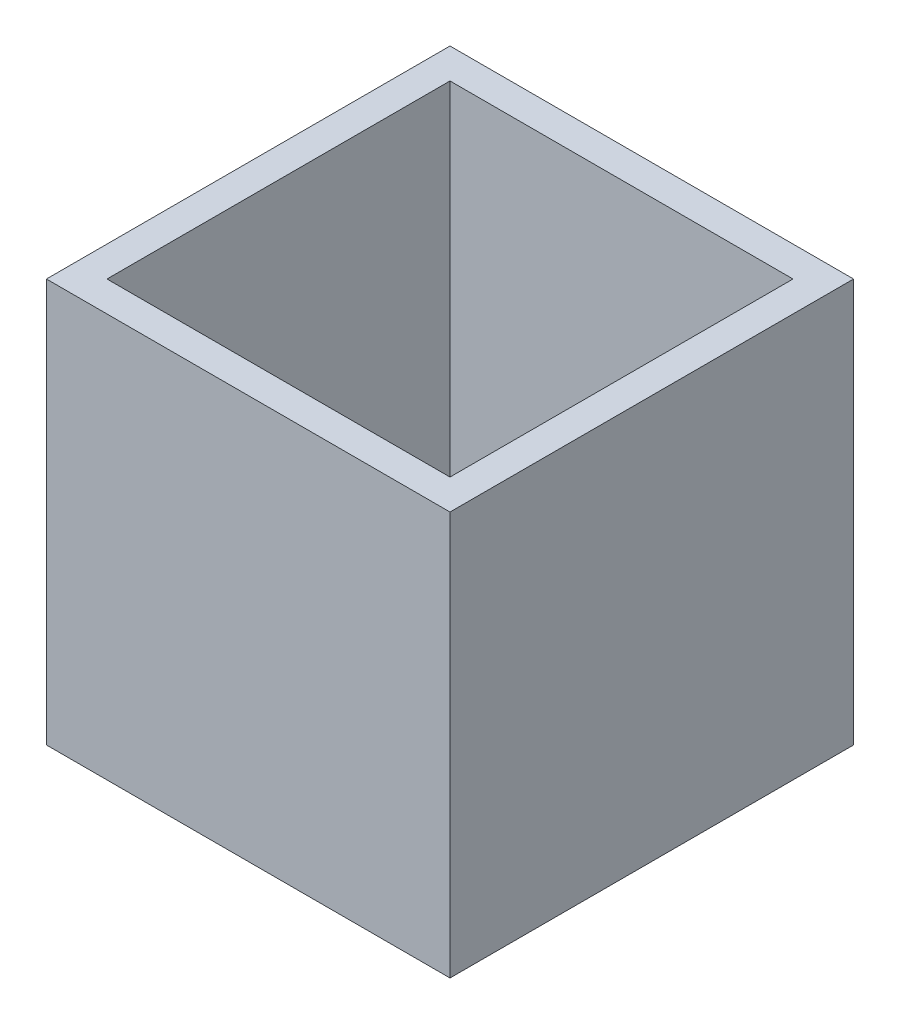
ISO-10303-21;
HEADER;
FILE_DESCRIPTION(('STEP AP214'),'2;1');
FILE_NAME('part.step','',(''),(''),'','','');
FILE_SCHEMA(('AUTOMOTIVE_DESIGN { 1 0 10303 214 1 1 1 1 }'));
ENDSEC;
DATA;
#1=APPLICATION_CONTEXT('core data for automotive mechanical design processes');
#2=APPLICATION_PROTOCOL_DEFINITION('international standard','automotive_design',2000,#1);
#3=PRODUCT_CONTEXT('',#1,'mechanical');
#4=PRODUCT('Part','Part','',(#3));
#5=PRODUCT_RELATED_PRODUCT_CATEGORY('part','',(#4));
#6=PRODUCT_DEFINITION_FORMATION('','',#4);
#7=PRODUCT_DEFINITION_CONTEXT('part definition',#1,'design');
#8=PRODUCT_DEFINITION('design','',#6,#7);
#9=PRODUCT_DEFINITION_SHAPE('','',#8);
#10=(LENGTH_UNIT() NAMED_UNIT(*) SI_UNIT(.MILLI.,.METRE.));
#11=(NAMED_UNIT(*) PLANE_ANGLE_UNIT() SI_UNIT($,.RADIAN.));
#12=(NAMED_UNIT(*) SI_UNIT($,.STERADIAN.) SOLID_ANGLE_UNIT());
#13=UNCERTAINTY_MEASURE_WITH_UNIT(LENGTH_MEASURE(1.E-05),#10,'distance_accuracy_value','');
#14=(GEOMETRIC_REPRESENTATION_CONTEXT(3) GLOBAL_UNCERTAINTY_ASSIGNED_CONTEXT((#13)) GLOBAL_UNIT_ASSIGNED_CONTEXT((#10,
#11,#12)) REPRESENTATION_CONTEXT('',''));
#15=CARTESIAN_POINT('',(0.,0.,0.));
#16=DIRECTION('',(0.,0.,1.));
#17=DIRECTION('',(1.,0.,0.));
#18=AXIS2_PLACEMENT_3D('',#15,#16,#17);
#19=CARTESIAN_POINT('',(0.,20.,0.));
#20=DIRECTION('',(-1.,0.,0.));
#21=DIRECTION('',(0.,0.,1.));
#22=AXIS2_PLACEMENT_3D('',#19,#20,#21);
#23=PLANE('',#22);
#24=DIRECTION('',(0.,0.,-1.));
#25=VECTOR('',#24,1.);
#26=CARTESIAN_POINT('',(0.,0.,0.));
#27=LINE('',#26,#25);
#28=CARTESIAN_POINT('',(0.,0.,0.));
#29=VERTEX_POINT('',#28);
#30=CARTESIAN_POINT('',(0.,0.,-20.));
#31=VERTEX_POINT('',#30);
#32=EDGE_CURVE('E149',#29,#31,#27,.T.);
#33=ORIENTED_EDGE('',*,*,#32,.T.);
#34=DIRECTION('',(0.,-1.,0.));
#35=VECTOR('',#34,1.);
#36=CARTESIAN_POINT('',(0.,20.,-20.));
#37=LINE('',#36,#35);
#38=CARTESIAN_POINT('',(0.,20.,-20.));
#39=VERTEX_POINT('',#38);
#40=EDGE_CURVE('E11',#39,#31,#37,.T.);
#41=ORIENTED_EDGE('',*,*,#40,.F.);
#42=DIRECTION('',(0.,0.,-1.));
#43=VECTOR('',#42,1.);
#44=CARTESIAN_POINT('',(0.,20.,0.));
#45=LINE('',#44,#43);
#46=CARTESIAN_POINT('',(0.,20.,0.));
#47=VERTEX_POINT('',#46);
#48=EDGE_CURVE('E142',#47,#39,#45,.T.);
#49=ORIENTED_EDGE('',*,*,#48,.F.);
#50=DIRECTION('',(0.,-1.,0.));
#51=VECTOR('',#50,1.);
#52=CARTESIAN_POINT('',(0.,20.,0.));
#53=LINE('',#52,#51);
#54=EDGE_CURVE('E148',#47,#29,#53,.T.);
#55=ORIENTED_EDGE('',*,*,#54,.T.);
#56=EDGE_LOOP('',(#33,#41,#49,#55));
#57=FACE_BOUND('',#56,.T.);
#58=ADVANCED_FACE('F33',(#57),#23,.F.);
#59=CARTESIAN_POINT('',(0.,20.,-20.));
#60=DIRECTION('',(0.,0.,1.));
#61=DIRECTION('',(1.,0.,0.));
#62=AXIS2_PLACEMENT_3D('',#59,#60,#61);
#63=PLANE('',#62);
#64=DIRECTION('',(-1.,0.,0.));
#65=VECTOR('',#64,1.);
#66=CARTESIAN_POINT('',(0.,0.,-20.));
#67=LINE('',#66,#65);
#68=CARTESIAN_POINT('',(-20.,0.,-20.));
#69=VERTEX_POINT('',#68);
#70=EDGE_CURVE('E152',#31,#69,#67,.T.);
#71=ORIENTED_EDGE('',*,*,#70,.T.);
#72=DIRECTION('',(0.,-1.,0.));
#73=VECTOR('',#72,1.);
#74=CARTESIAN_POINT('',(-20.,20.,-20.));
#75=LINE('',#74,#73);
#76=CARTESIAN_POINT('',(-20.,20.,-20.));
#77=VERTEX_POINT('',#76);
#78=EDGE_CURVE('E41',#77,#69,#75,.T.);
#79=ORIENTED_EDGE('',*,*,#78,.F.);
#80=DIRECTION('',(-1.,0.,0.));
#81=VECTOR('',#80,1.);
#82=CARTESIAN_POINT('',(0.,20.,-20.));
#83=LINE('',#82,#81);
#84=EDGE_CURVE('E86',#39,#77,#83,.T.);
#85=ORIENTED_EDGE('',*,*,#84,.F.);
#86=ORIENTED_EDGE('',*,*,#40,.T.);
#87=EDGE_LOOP('',(#71,#79,#85,#86));
#88=FACE_BOUND('',#87,.T.);
#89=ADVANCED_FACE('F199',(#88),#63,.F.);
#90=CARTESIAN_POINT('',(-20.,20.,0.));
#91=DIRECTION('',(1.,0.,0.));
#92=DIRECTION('',(0.,0.,-1.));
#93=AXIS2_PLACEMENT_3D('',#90,#91,#92);
#94=PLANE('',#93);
#95=DIRECTION('',(0.,0.,1.));
#96=VECTOR('',#95,1.);
#97=CARTESIAN_POINT('',(-20.,0.,0.));
#98=LINE('',#97,#96);
#99=CARTESIAN_POINT('',(-20.,0.,0.));
#100=VERTEX_POINT('',#99);
#101=EDGE_CURVE('E154',#69,#100,#98,.T.);
#102=ORIENTED_EDGE('',*,*,#101,.T.);
#103=DIRECTION('',(0.,-1.,0.));
#104=VECTOR('',#103,1.);
#105=CARTESIAN_POINT('',(-20.,20.,0.));
#106=LINE('',#105,#104);
#107=CARTESIAN_POINT('',(-20.,20.,0.));
#108=VERTEX_POINT('',#107);
#109=EDGE_CURVE('E158',#108,#100,#106,.T.);
#110=ORIENTED_EDGE('',*,*,#109,.F.);
#111=DIRECTION('',(0.,0.,1.));
#112=VECTOR('',#111,1.);
#113=CARTESIAN_POINT('',(-20.,20.,0.));
#114=LINE('',#113,#112);
#115=EDGE_CURVE('E145',#77,#108,#114,.T.);
#116=ORIENTED_EDGE('',*,*,#115,.F.);
#117=ORIENTED_EDGE('',*,*,#78,.T.);
#118=EDGE_LOOP('',(#102,#110,#116,#117));
#119=FACE_BOUND('',#118,.T.);
#120=ADVANCED_FACE('F204',(#119),#94,.F.);
#121=CARTESIAN_POINT('',(0.,20.,0.));
#122=DIRECTION('',(0.,0.,-1.));
#123=DIRECTION('',(-1.,0.,0.));
#124=AXIS2_PLACEMENT_3D('',#121,#122,#123);
#125=PLANE('',#124);
#126=DIRECTION('',(1.,0.,0.));
#127=VECTOR('',#126,1.);
#128=CARTESIAN_POINT('',(0.,0.,0.));
#129=LINE('',#128,#127);
#130=EDGE_CURVE('E79',#100,#29,#129,.T.);
#131=ORIENTED_EDGE('',*,*,#130,.T.);
#132=ORIENTED_EDGE('',*,*,#54,.F.);
#133=DIRECTION('',(1.,0.,0.));
#134=VECTOR('',#133,1.);
#135=CARTESIAN_POINT('',(0.,20.,0.));
#136=LINE('',#135,#134);
#137=EDGE_CURVE('E58',#108,#47,#136,.T.);
#138=ORIENTED_EDGE('',*,*,#137,.F.);
#139=ORIENTED_EDGE('',*,*,#109,.T.);
#140=EDGE_LOOP('',(#131,#132,#138,#139));
#141=FACE_BOUND('',#140,.T.);
#142=ADVANCED_FACE('F193',(#141),#125,.F.);
#143=CARTESIAN_POINT('',(0.,20.,0.));
#144=DIRECTION('',(0.,1.,0.));
#145=DIRECTION('',(0.,0.,1.));
#146=AXIS2_PLACEMENT_3D('',#143,#144,#145);
#147=PLANE('',#146);
#148=DIRECTION('',(0.,0.,-1.));
#149=VECTOR('',#148,1.);
#150=CARTESIAN_POINT('',(-1.5,20.,0.));
#151=LINE('',#150,#149);
#152=CARTESIAN_POINT('',(-1.5,20.,-1.5));
#153=VERTEX_POINT('',#152);
#154=CARTESIAN_POINT('',(-1.5,20.,-18.5));
#155=VERTEX_POINT('',#154);
#156=EDGE_CURVE('E131',#153,#155,#151,.T.);
#157=ORIENTED_EDGE('',*,*,#156,.F.);
#158=DIRECTION('',(1.,0.,0.));
#159=VECTOR('',#158,1.);
#160=CARTESIAN_POINT('',(0.,20.,-1.5));
#161=LINE('',#160,#159);
#162=CARTESIAN_POINT('',(-18.5,20.,-1.5));
#163=VERTEX_POINT('',#162);
#164=EDGE_CURVE('E140',#163,#153,#161,.T.);
#165=ORIENTED_EDGE('',*,*,#164,.F.);
#166=DIRECTION('',(0.,0.,1.));
#167=VECTOR('',#166,1.);
#168=CARTESIAN_POINT('',(-18.5,20.,0.));
#169=LINE('',#168,#167);
#170=CARTESIAN_POINT('',(-18.5,20.,-18.5));
#171=VERTEX_POINT('',#170);
#172=EDGE_CURVE('E138',#171,#163,#169,.T.);
#173=ORIENTED_EDGE('',*,*,#172,.F.);
#174=DIRECTION('',(-1.,0.,0.));
#175=VECTOR('',#174,1.);
#176=CARTESIAN_POINT('',(0.,20.,-18.5));
#177=LINE('',#176,#175);
#178=EDGE_CURVE('E123',#155,#171,#177,.T.);
#179=ORIENTED_EDGE('',*,*,#178,.F.);
#180=EDGE_LOOP('',(#157,#165,#173,#179));
#181=FACE_BOUND('',#180,.T.);
#182=ORIENTED_EDGE('',*,*,#48,.T.);
#183=ORIENTED_EDGE('',*,*,#84,.T.);
#184=ORIENTED_EDGE('',*,*,#115,.T.);
#185=ORIENTED_EDGE('',*,*,#137,.T.);
#186=EDGE_LOOP('',(#182,#183,#184,#185));
#187=FACE_BOUND('',#186,.T.);
#188=ADVANCED_FACE('F190',(#181,#187),#147,.T.);
#189=CARTESIAN_POINT('',(0.,0.,0.));
#190=DIRECTION('',(0.,1.,0.));
#191=DIRECTION('',(0.,0.,1.));
#192=AXIS2_PLACEMENT_3D('',#189,#190,#191);
#193=PLANE('',#192);
#194=CARTESIAN_POINT('',(-4.96673105478873,0.,-11.7177865393092));
#195=DIRECTION('',(0.,-1.,0.));
#196=DIRECTION('',(0.,0.,-1.));
#197=AXIS2_PLACEMENT_3D('',#194,#195,#196);
#198=CIRCLE('',#197,3.);
#199=CARTESIAN_POINT('',(-4.96673105478873,0.,-14.7177865393092));
#200=VERTEX_POINT('',#199);
#201=EDGE_CURVE('E177',#200,#200,#198,.T.);
#202=ORIENTED_EDGE('',*,*,#201,.F.);
#203=EDGE_LOOP('',(#202));
#204=FACE_BOUND('',#203,.T.);
#205=CARTESIAN_POINT('',(-9.41785308776044,0.,-15.1040706985022));
#206=DIRECTION('',(0.,-1.,0.));
#207=DIRECTION('',(0.,0.,-1.));
#208=AXIS2_PLACEMENT_3D('',#205,#206,#207);
#209=CIRCLE('',#208,0.75);
#210=CARTESIAN_POINT('',(-9.41785308776044,0.,-15.8540706985022));
#211=VERTEX_POINT('',#210);
#212=EDGE_CURVE('E167',#211,#211,#209,.T.);
#213=ORIENTED_EDGE('',*,*,#212,.F.);
#214=EDGE_LOOP('',(#213));
#215=FACE_BOUND('',#214,.T.);
#216=CARTESIAN_POINT('',(-13.1470420843636,0.,-8.40138736485407));
#217=DIRECTION('',(0.,-1.,0.));
#218=DIRECTION('',(0.,0.,-1.));
#219=AXIS2_PLACEMENT_3D('',#216,#217,#218);
#220=CIRCLE('',#219,5.);
#221=CARTESIAN_POINT('',(-13.1470420843636,0.,-13.4013873648541));
#222=VERTEX_POINT('',#221);
#223=EDGE_CURVE('E164',#222,#222,#220,.T.);
#224=ORIENTED_EDGE('',*,*,#223,.F.);
#225=EDGE_LOOP('',(#224));
#226=FACE_BOUND('',#225,.T.);
#227=ORIENTED_EDGE('',*,*,#32,.F.);
#228=ORIENTED_EDGE('',*,*,#130,.F.);
#229=ORIENTED_EDGE('',*,*,#101,.F.);
#230=ORIENTED_EDGE('',*,*,#70,.F.);
#231=EDGE_LOOP('',(#227,#228,#229,#230));
#232=FACE_BOUND('',#231,.T.);
#233=ADVANCED_FACE('F192',(#204,#215,#226,#232),#193,.F.);
#234=CARTESIAN_POINT('',(-1.5,20.,0.));
#235=DIRECTION('',(-1.,0.,0.));
#236=DIRECTION('',(0.,0.,1.));
#237=AXIS2_PLACEMENT_3D('',#234,#235,#236);
#238=PLANE('',#237);
#239=DIRECTION('',(0.,0.,-1.));
#240=VECTOR('',#239,1.);
#241=CARTESIAN_POINT('',(-1.5,1.5,0.));
#242=LINE('',#241,#240);
#243=CARTESIAN_POINT('',(-1.5,1.5,-1.5));
#244=VERTEX_POINT('',#243);
#245=CARTESIAN_POINT('',(-1.5,1.5,-18.5));
#246=VERTEX_POINT('',#245);
#247=EDGE_CURVE('E114',#244,#246,#242,.T.);
#248=ORIENTED_EDGE('',*,*,#247,.F.);
#249=DIRECTION('',(0.,-1.,0.));
#250=VECTOR('',#249,1.);
#251=CARTESIAN_POINT('',(-1.5,20.,-1.5));
#252=LINE('',#251,#250);
#253=EDGE_CURVE('E134',#153,#244,#252,.T.);
#254=ORIENTED_EDGE('',*,*,#253,.F.);
#255=ORIENTED_EDGE('',*,*,#156,.T.);
#256=DIRECTION('',(0.,-1.,0.));
#257=VECTOR('',#256,1.);
#258=CARTESIAN_POINT('',(-1.5,20.,-18.5));
#259=LINE('',#258,#257);
#260=EDGE_CURVE('E126',#155,#246,#259,.T.);
#261=ORIENTED_EDGE('',*,*,#260,.T.);
#262=EDGE_LOOP('',(#248,#254,#255,#261));
#263=FACE_BOUND('',#262,.T.);
#264=ADVANCED_FACE('F188',(#263),#238,.T.);
#265=CARTESIAN_POINT('',(0.,20.,-18.5));
#266=DIRECTION('',(0.,0.,1.));
#267=DIRECTION('',(1.,0.,0.));
#268=AXIS2_PLACEMENT_3D('',#265,#266,#267);
#269=PLANE('',#268);
#270=DIRECTION('',(-1.,0.,0.));
#271=VECTOR('',#270,1.);
#272=CARTESIAN_POINT('',(0.,1.5,-18.5));
#273=LINE('',#272,#271);
#274=CARTESIAN_POINT('',(-18.5,1.5,-18.5));
#275=VERTEX_POINT('',#274);
#276=EDGE_CURVE('E108',#246,#275,#273,.T.);
#277=ORIENTED_EDGE('',*,*,#276,.F.);
#278=ORIENTED_EDGE('',*,*,#260,.F.);
#279=ORIENTED_EDGE('',*,*,#178,.T.);
#280=DIRECTION('',(0.,-1.,0.));
#281=VECTOR('',#280,1.);
#282=CARTESIAN_POINT('',(-18.5,20.,-18.5));
#283=LINE('',#282,#281);
#284=EDGE_CURVE('E120',#171,#275,#283,.T.);
#285=ORIENTED_EDGE('',*,*,#284,.T.);
#286=EDGE_LOOP('',(#277,#278,#279,#285));
#287=FACE_BOUND('',#286,.T.);
#288=ADVANCED_FACE('F121',(#287),#269,.T.);
#289=CARTESIAN_POINT('',(-18.5,20.,0.));
#290=DIRECTION('',(1.,0.,0.));
#291=DIRECTION('',(0.,0.,-1.));
#292=AXIS2_PLACEMENT_3D('',#289,#290,#291);
#293=PLANE('',#292);
#294=DIRECTION('',(0.,0.,1.));
#295=VECTOR('',#294,1.);
#296=CARTESIAN_POINT('',(-18.5,1.5,0.));
#297=LINE('',#296,#295);
#298=CARTESIAN_POINT('',(-18.5,1.5,-1.5));
#299=VERTEX_POINT('',#298);
#300=EDGE_CURVE('E112',#275,#299,#297,.T.);
#301=ORIENTED_EDGE('',*,*,#300,.F.);
#302=ORIENTED_EDGE('',*,*,#284,.F.);
#303=ORIENTED_EDGE('',*,*,#172,.T.);
#304=DIRECTION('',(0.,-1.,0.));
#305=VECTOR('',#304,1.);
#306=CARTESIAN_POINT('',(-18.5,20.,-1.5));
#307=LINE('',#306,#305);
#308=EDGE_CURVE('E49',#163,#299,#307,.T.);
#309=ORIENTED_EDGE('',*,*,#308,.T.);
#310=EDGE_LOOP('',(#301,#302,#303,#309));
#311=FACE_BOUND('',#310,.T.);
#312=ADVANCED_FACE('F128',(#311),#293,.T.);
#313=CARTESIAN_POINT('',(0.,20.,-1.5));
#314=DIRECTION('',(0.,0.,-1.));
#315=DIRECTION('',(-1.,0.,0.));
#316=AXIS2_PLACEMENT_3D('',#313,#314,#315);
#317=PLANE('',#316);
#318=DIRECTION('',(1.,0.,0.));
#319=VECTOR('',#318,1.);
#320=CARTESIAN_POINT('',(0.,1.5,-1.5));
#321=LINE('',#320,#319);
#322=EDGE_CURVE('E129',#299,#244,#321,.T.);
#323=ORIENTED_EDGE('',*,*,#322,.F.);
#324=ORIENTED_EDGE('',*,*,#308,.F.);
#325=ORIENTED_EDGE('',*,*,#164,.T.);
#326=ORIENTED_EDGE('',*,*,#253,.T.);
#327=EDGE_LOOP('',(#323,#324,#325,#326));
#328=FACE_BOUND('',#327,.T.);
#329=ADVANCED_FACE('F184',(#328),#317,.T.);
#330=CARTESIAN_POINT('',(0.,1.5,0.));
#331=DIRECTION('',(0.,1.,0.));
#332=DIRECTION('',(0.,0.,1.));
#333=AXIS2_PLACEMENT_3D('',#330,#331,#332);
#334=PLANE('',#333);
#335=CARTESIAN_POINT('',(-4.96673105478873,1.5,-11.7177865393092));
#336=DIRECTION('',(0.,1.,0.));
#337=DIRECTION('',(0.,0.,1.));
#338=AXIS2_PLACEMENT_3D('',#335,#336,#337);
#339=CIRCLE('',#338,3.);
#340=CARTESIAN_POINT('',(-4.96673105478873,1.5,-8.71778653930921));
#341=VERTEX_POINT('',#340);
#342=EDGE_CURVE('E36',#341,#341,#339,.T.);
#343=ORIENTED_EDGE('',*,*,#342,.F.);
#344=EDGE_LOOP('',(#343));
#345=FACE_BOUND('',#344,.T.);
#346=CARTESIAN_POINT('',(-9.41785308776044,1.5,-15.1040706985022));
#347=DIRECTION('',(0.,1.,0.));
#348=DIRECTION('',(0.,0.,1.));
#349=AXIS2_PLACEMENT_3D('',#346,#347,#348);
#350=CIRCLE('',#349,0.75);
#351=CARTESIAN_POINT('',(-9.41785308776044,1.5,-14.3540706985022));
#352=VERTEX_POINT('',#351);
#353=EDGE_CURVE('E165',#352,#352,#350,.T.);
#354=ORIENTED_EDGE('',*,*,#353,.F.);
#355=EDGE_LOOP('',(#354));
#356=FACE_BOUND('',#355,.T.);
#357=CARTESIAN_POINT('',(-13.1470420843636,1.5,-8.40138736485407));
#358=DIRECTION('',(0.,1.,0.));
#359=DIRECTION('',(0.,0.,1.));
#360=AXIS2_PLACEMENT_3D('',#357,#358,#359);
#361=CIRCLE('',#360,5.);
#362=CARTESIAN_POINT('',(-13.1470420843636,1.5,-3.40138736485407));
#363=VERTEX_POINT('',#362);
#364=EDGE_CURVE('E162',#363,#363,#361,.T.);
#365=ORIENTED_EDGE('',*,*,#364,.F.);
#366=EDGE_LOOP('',(#365));
#367=FACE_BOUND('',#366,.T.);
#368=ORIENTED_EDGE('',*,*,#247,.T.);
#369=ORIENTED_EDGE('',*,*,#276,.T.);
#370=ORIENTED_EDGE('',*,*,#300,.T.);
#371=ORIENTED_EDGE('',*,*,#322,.T.);
#372=EDGE_LOOP('',(#368,#369,#370,#371));
#373=FACE_BOUND('',#372,.T.);
#374=ADVANCED_FACE('F110',(#345,#356,#367,#373),#334,.T.);
#375=CARTESIAN_POINT('',(-13.1470420843636,20.,-8.40138736485407));
#376=DIRECTION('',(0.,-1.,0.));
#377=DIRECTION('',(0.,0.,-1.));
#378=AXIS2_PLACEMENT_3D('',#375,#376,#377);
#379=CYLINDRICAL_SURFACE('',#378,5.);
#380=ORIENTED_EDGE('',*,*,#364,.T.);
#381=EDGE_LOOP('',(#380));
#382=FACE_BOUND('',#381,.T.);
#383=ORIENTED_EDGE('',*,*,#223,.T.);
#384=EDGE_LOOP('',(#383));
#385=FACE_BOUND('',#384,.T.);
#386=ADVANCED_FACE('F276',(#382,#385),#379,.F.);
#387=CARTESIAN_POINT('',(-9.41785308776044,20.,-15.1040706985022));
#388=DIRECTION('',(0.,-1.,0.));
#389=DIRECTION('',(0.,0.,-1.));
#390=AXIS2_PLACEMENT_3D('',#387,#388,#389);
#391=CYLINDRICAL_SURFACE('',#390,0.75);
#392=ORIENTED_EDGE('',*,*,#353,.T.);
#393=EDGE_LOOP('',(#392));
#394=FACE_BOUND('',#393,.T.);
#395=ORIENTED_EDGE('',*,*,#212,.T.);
#396=EDGE_LOOP('',(#395));
#397=FACE_BOUND('',#396,.T.);
#398=ADVANCED_FACE('F286',(#394,#397),#391,.F.);
#399=CARTESIAN_POINT('',(-4.96673105478873,20.,-11.7177865393092));
#400=DIRECTION('',(0.,-1.,0.));
#401=DIRECTION('',(0.,0.,-1.));
#402=AXIS2_PLACEMENT_3D('',#399,#400,#401);
#403=CYLINDRICAL_SURFACE('',#402,3.);
#404=ORIENTED_EDGE('',*,*,#342,.T.);
#405=EDGE_LOOP('',(#404));
#406=FACE_BOUND('',#405,.T.);
#407=ORIENTED_EDGE('',*,*,#201,.T.);
#408=EDGE_LOOP('',(#407));
#409=FACE_BOUND('',#408,.T.);
#410=ADVANCED_FACE('F296',(#406,#409),#403,.F.);
#411=CLOSED_SHELL('',(#58,#89,#120,#142,#188,#233,#264,#288,#312,#329,#374,#386,#398,#410));
#412=MANIFOLD_SOLID_BREP('B2',#411);
#413=ADVANCED_BREP_SHAPE_REPRESENTATION('',(#18,#412),#14);
#414=SHAPE_DEFINITION_REPRESENTATION(#9,#413);
ENDSEC;
END-ISO-10303-21;
